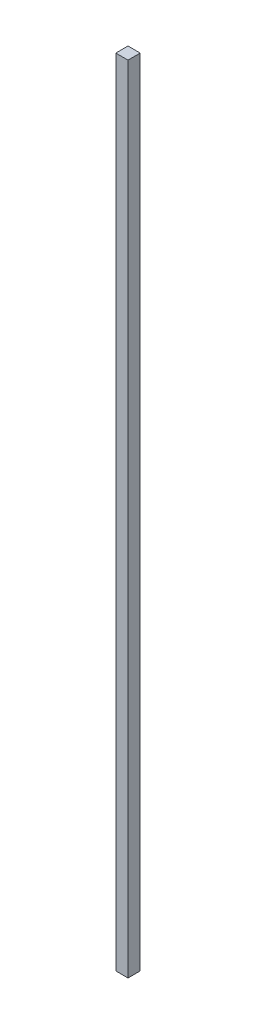
ISO-10303-21;
HEADER;
FILE_DESCRIPTION(('STEP AP214'),'2;1');
FILE_NAME('part.step','',(''),(''),'','','');
FILE_SCHEMA(('AUTOMOTIVE_DESIGN { 1 0 10303 214 1 1 1 1 }'));
ENDSEC;
DATA;
#1=APPLICATION_CONTEXT('core data for automotive mechanical design processes');
#2=APPLICATION_PROTOCOL_DEFINITION('international standard','automotive_design',2000,#1);
#3=PRODUCT_CONTEXT('',#1,'mechanical');
#4=PRODUCT('Part','Part','',(#3));
#5=PRODUCT_RELATED_PRODUCT_CATEGORY('part','',(#4));
#6=PRODUCT_DEFINITION_FORMATION('','',#4);
#7=PRODUCT_DEFINITION_CONTEXT('part definition',#1,'design');
#8=PRODUCT_DEFINITION('design','',#6,#7);
#9=PRODUCT_DEFINITION_SHAPE('','',#8);
#10=(LENGTH_UNIT() NAMED_UNIT(*) SI_UNIT(.MILLI.,.METRE.));
#11=(NAMED_UNIT(*) PLANE_ANGLE_UNIT() SI_UNIT($,.RADIAN.));
#12=(NAMED_UNIT(*) SI_UNIT($,.STERADIAN.) SOLID_ANGLE_UNIT());
#13=UNCERTAINTY_MEASURE_WITH_UNIT(LENGTH_MEASURE(1.E-05),#10,'distance_accuracy_value','');
#14=(GEOMETRIC_REPRESENTATION_CONTEXT(3) GLOBAL_UNCERTAINTY_ASSIGNED_CONTEXT((#13)) GLOBAL_UNIT_ASSIGNED_CONTEXT((#10,
#11,#12)) REPRESENTATION_CONTEXT('',''));
#15=CARTESIAN_POINT('',(0.,0.,0.));
#16=DIRECTION('',(0.,0.,1.));
#17=DIRECTION('',(1.,0.,0.));
#18=AXIS2_PLACEMENT_3D('',#15,#16,#17);
#19=CARTESIAN_POINT('',(10.,1300.,10.));
#20=DIRECTION('',(-1.,0.,0.));
#21=DIRECTION('',(0.,0.,1.));
#22=AXIS2_PLACEMENT_3D('',#19,#20,#21);
#23=PLANE('',#22);
#24=DIRECTION('',(0.,-1.,0.));
#25=VECTOR('',#24,1.);
#26=CARTESIAN_POINT('',(10.,1300.,10.));
#27=LINE('',#26,#25);
#28=CARTESIAN_POINT('',(10.,1301.,10.));
#29=VERTEX_POINT('',#28);
#30=CARTESIAN_POINT('',(10.,-1.,10.));
#31=VERTEX_POINT('',#30);
#32=EDGE_CURVE('E194',#29,#31,#27,.T.);
#33=ORIENTED_EDGE('',*,*,#32,.T.);
#34=DIRECTION('',(0.,0.,1.));
#35=VECTOR('',#34,1.);
#36=CARTESIAN_POINT('',(10.,-1.,10.));
#37=LINE('',#36,#35);
#38=CARTESIAN_POINT('',(10.,-1.,-10.));
#39=VERTEX_POINT('',#38);
#40=EDGE_CURVE('E134',#39,#31,#37,.T.);
#41=ORIENTED_EDGE('',*,*,#40,.F.);
#42=DIRECTION('',(0.,-1.,0.));
#43=VECTOR('',#42,1.);
#44=CARTESIAN_POINT('',(10.,1300.,-10.));
#45=LINE('',#44,#43);
#46=CARTESIAN_POINT('',(10.,1301.,-10.));
#47=VERTEX_POINT('',#46);
#48=EDGE_CURVE('E11',#47,#39,#45,.T.);
#49=ORIENTED_EDGE('',*,*,#48,.F.);
#50=DIRECTION('',(0.,0.,-1.));
#51=VECTOR('',#50,1.);
#52=CARTESIAN_POINT('',(10.,1301.,-10.));
#53=LINE('',#52,#51);
#54=EDGE_CURVE('E153',#29,#47,#53,.T.);
#55=ORIENTED_EDGE('',*,*,#54,.F.);
#56=EDGE_LOOP('',(#33,#41,#49,#55));
#57=FACE_BOUND('',#56,.T.);
#58=ADVANCED_FACE('F40',(#57),#23,.F.);
#59=CARTESIAN_POINT('',(-10.,1300.,-10.));
#60=DIRECTION('',(0.,0.,1.));
#61=DIRECTION('',(1.,0.,0.));
#62=AXIS2_PLACEMENT_3D('',#59,#60,#61);
#63=PLANE('',#62);
#64=ORIENTED_EDGE('',*,*,#48,.T.);
#65=DIRECTION('',(1.,0.,0.));
#66=VECTOR('',#65,1.);
#67=CARTESIAN_POINT('',(-10.,-1.,-10.));
#68=LINE('',#67,#66);
#69=CARTESIAN_POINT('',(-10.,-1.,-10.));
#70=VERTEX_POINT('',#69);
#71=EDGE_CURVE('E128',#70,#39,#68,.T.);
#72=ORIENTED_EDGE('',*,*,#71,.F.);
#73=DIRECTION('',(0.,-1.,0.));
#74=VECTOR('',#73,1.);
#75=CARTESIAN_POINT('',(-10.,1300.,-10.));
#76=LINE('',#75,#74);
#77=CARTESIAN_POINT('',(-10.,1301.,-10.));
#78=VERTEX_POINT('',#77);
#79=EDGE_CURVE('E49',#78,#70,#76,.T.);
#80=ORIENTED_EDGE('',*,*,#79,.F.);
#81=DIRECTION('',(-1.,0.,0.));
#82=VECTOR('',#81,1.);
#83=CARTESIAN_POINT('',(-10.,1301.,-10.));
#84=LINE('',#83,#82);
#85=EDGE_CURVE('E157',#47,#78,#84,.T.);
#86=ORIENTED_EDGE('',*,*,#85,.F.);
#87=EDGE_LOOP('',(#64,#72,#80,#86));
#88=FACE_BOUND('',#87,.T.);
#89=ADVANCED_FACE('F129',(#88),#63,.F.);
#90=CARTESIAN_POINT('',(-10.,1300.,10.));
#91=DIRECTION('',(1.,0.,0.));
#92=DIRECTION('',(0.,0.,-1.));
#93=AXIS2_PLACEMENT_3D('',#90,#91,#92);
#94=PLANE('',#93);
#95=ORIENTED_EDGE('',*,*,#79,.T.);
#96=DIRECTION('',(0.,0.,-1.));
#97=VECTOR('',#96,1.);
#98=CARTESIAN_POINT('',(-10.,-1.,10.));
#99=LINE('',#98,#97);
#100=CARTESIAN_POINT('',(-10.,-1.,10.));
#101=VERTEX_POINT('',#100);
#102=EDGE_CURVE('E119',#101,#70,#99,.T.);
#103=ORIENTED_EDGE('',*,*,#102,.F.);
#104=DIRECTION('',(0.,-1.,0.));
#105=VECTOR('',#104,1.);
#106=CARTESIAN_POINT('',(-10.,1300.,10.));
#107=LINE('',#106,#105);
#108=CARTESIAN_POINT('',(-10.,1301.,10.));
#109=VERTEX_POINT('',#108);
#110=EDGE_CURVE('E126',#109,#101,#107,.T.);
#111=ORIENTED_EDGE('',*,*,#110,.F.);
#112=DIRECTION('',(0.,0.,1.));
#113=VECTOR('',#112,1.);
#114=CARTESIAN_POINT('',(-10.,1301.,-10.));
#115=LINE('',#114,#113);
#116=EDGE_CURVE('E121',#78,#109,#115,.T.);
#117=ORIENTED_EDGE('',*,*,#116,.F.);
#118=EDGE_LOOP('',(#95,#103,#111,#117));
#119=FACE_BOUND('',#118,.T.);
#120=ADVANCED_FACE('F117',(#119),#94,.F.);
#121=CARTESIAN_POINT('',(-10.,1300.,10.));
#122=DIRECTION('',(0.,0.,-1.));
#123=DIRECTION('',(-1.,0.,0.));
#124=AXIS2_PLACEMENT_3D('',#121,#122,#123);
#125=PLANE('',#124);
#126=ORIENTED_EDGE('',*,*,#110,.T.);
#127=DIRECTION('',(-1.,0.,0.));
#128=VECTOR('',#127,1.);
#129=CARTESIAN_POINT('',(-10.,-1.,10.));
#130=LINE('',#129,#128);
#131=EDGE_CURVE('E139',#31,#101,#130,.T.);
#132=ORIENTED_EDGE('',*,*,#131,.F.);
#133=ORIENTED_EDGE('',*,*,#32,.F.);
#134=DIRECTION('',(1.,0.,0.));
#135=VECTOR('',#134,1.);
#136=CARTESIAN_POINT('',(-10.,1301.,10.));
#137=LINE('',#136,#135);
#138=EDGE_CURVE('E149',#109,#29,#137,.T.);
#139=ORIENTED_EDGE('',*,*,#138,.F.);
#140=EDGE_LOOP('',(#126,#132,#133,#139));
#141=FACE_BOUND('',#140,.T.);
#142=ADVANCED_FACE('F200',(#141),#125,.F.);
#143=CARTESIAN_POINT('',(0.,1301.,0.));
#144=DIRECTION('',(0.,1.,0.));
#145=DIRECTION('',(0.,0.,1.));
#146=AXIS2_PLACEMENT_3D('',#143,#144,#145);
#147=PLANE('',#146);
#148=ORIENTED_EDGE('',*,*,#116,.T.);
#149=ORIENTED_EDGE('',*,*,#138,.T.);
#150=ORIENTED_EDGE('',*,*,#54,.T.);
#151=ORIENTED_EDGE('',*,*,#85,.T.);
#152=EDGE_LOOP('',(#148,#149,#150,#151));
#153=FACE_BOUND('',#152,.T.);
#154=ADVANCED_FACE('F203',(#153),#147,.T.);
#155=CARTESIAN_POINT('',(0.,-1.,0.));
#156=DIRECTION('',(0.,-1.,0.));
#157=DIRECTION('',(0.,0.,-1.));
#158=AXIS2_PLACEMENT_3D('',#155,#156,#157);
#159=PLANE('',#158);
#160=ORIENTED_EDGE('',*,*,#102,.T.);
#161=ORIENTED_EDGE('',*,*,#71,.T.);
#162=ORIENTED_EDGE('',*,*,#40,.T.);
#163=ORIENTED_EDGE('',*,*,#131,.T.);
#164=EDGE_LOOP('',(#160,#161,#162,#163));
#165=FACE_BOUND('',#164,.T.);
#166=ADVANCED_FACE('F137',(#165),#159,.T.);
#167=CLOSED_SHELL('',(#58,#89,#120,#142,#154,#166));
#168=CARTESIAN_POINT('',(0.,0.,0.));
#169=DIRECTION('',(0.,-1.,0.));
#170=DIRECTION('',(0.,0.,-1.));
#171=AXIS2_PLACEMENT_3D('',#168,#169,#170);
#172=PLANE('',#171);
#173=DIRECTION('',(0.,0.,-1.));
#174=VECTOR('',#173,1.);
#175=CARTESIAN_POINT('',(8.,0.,8.));
#176=LINE('',#175,#174);
#177=CARTESIAN_POINT('',(8.,0.,8.));
#178=VERTEX_POINT('',#177);
#179=CARTESIAN_POINT('',(8.,0.,-8.));
#180=VERTEX_POINT('',#179);
#181=EDGE_CURVE('E175',#178,#180,#176,.T.);
#182=ORIENTED_EDGE('',*,*,#181,.T.);
#183=DIRECTION('',(-1.,0.,0.));
#184=VECTOR('',#183,1.);
#185=CARTESIAN_POINT('',(-8.,0.,-8.));
#186=LINE('',#185,#184);
#187=CARTESIAN_POINT('',(-8.,0.,-8.));
#188=VERTEX_POINT('',#187);
#189=EDGE_CURVE('E163',#180,#188,#186,.T.);
#190=ORIENTED_EDGE('',*,*,#189,.T.);
#191=DIRECTION('',(0.,0.,1.));
#192=VECTOR('',#191,1.);
#193=CARTESIAN_POINT('',(-8.,0.,8.));
#194=LINE('',#193,#192);
#195=CARTESIAN_POINT('',(-8.,0.,8.));
#196=VERTEX_POINT('',#195);
#197=EDGE_CURVE('E56',#188,#196,#194,.T.);
#198=ORIENTED_EDGE('',*,*,#197,.T.);
#199=DIRECTION('',(1.,0.,0.));
#200=VECTOR('',#199,1.);
#201=CARTESIAN_POINT('',(-8.,0.,8.));
#202=LINE('',#201,#200);
#203=EDGE_CURVE('E77',#196,#178,#202,.T.);
#204=ORIENTED_EDGE('',*,*,#203,.T.);
#205=EDGE_LOOP('',(#182,#190,#198,#204));
#206=FACE_BOUND('',#205,.T.);
#207=ADVANCED_FACE('F235',(#206),#172,.F.);
#208=CARTESIAN_POINT('',(0.,1300.,0.));
#209=DIRECTION('',(0.,1.,0.));
#210=DIRECTION('',(0.,0.,1.));
#211=AXIS2_PLACEMENT_3D('',#208,#209,#210);
#212=PLANE('',#211);
#213=DIRECTION('',(0.,0.,1.));
#214=VECTOR('',#213,1.);
#215=CARTESIAN_POINT('',(-8.,1300.,8.));
#216=LINE('',#215,#214);
#217=CARTESIAN_POINT('',(-8.,1300.,-8.));
#218=VERTEX_POINT('',#217);
#219=CARTESIAN_POINT('',(-8.,1300.,8.));
#220=VERTEX_POINT('',#219);
#221=EDGE_CURVE('E81',#218,#220,#216,.T.);
#222=ORIENTED_EDGE('',*,*,#221,.F.);
#223=DIRECTION('',(-1.,0.,0.));
#224=VECTOR('',#223,1.);
#225=CARTESIAN_POINT('',(-8.,1300.,-8.));
#226=LINE('',#225,#224);
#227=CARTESIAN_POINT('',(8.,1300.,-8.));
#228=VERTEX_POINT('',#227);
#229=EDGE_CURVE('E84',#228,#218,#226,.T.);
#230=ORIENTED_EDGE('',*,*,#229,.F.);
#231=DIRECTION('',(0.,0.,-1.));
#232=VECTOR('',#231,1.);
#233=CARTESIAN_POINT('',(8.,1300.,8.));
#234=LINE('',#233,#232);
#235=CARTESIAN_POINT('',(8.,1300.,8.));
#236=VERTEX_POINT('',#235);
#237=EDGE_CURVE('E65',#236,#228,#234,.T.);
#238=ORIENTED_EDGE('',*,*,#237,.F.);
#239=DIRECTION('',(1.,0.,0.));
#240=VECTOR('',#239,1.);
#241=CARTESIAN_POINT('',(-8.,1300.,8.));
#242=LINE('',#241,#240);
#243=EDGE_CURVE('E162',#220,#236,#242,.T.);
#244=ORIENTED_EDGE('',*,*,#243,.F.);
#245=EDGE_LOOP('',(#222,#230,#238,#244));
#246=FACE_BOUND('',#245,.T.);
#247=ADVANCED_FACE('F228',(#246),#212,.F.);
#248=CARTESIAN_POINT('',(8.,1300.,8.));
#249=DIRECTION('',(-1.,0.,0.));
#250=DIRECTION('',(0.,0.,1.));
#251=AXIS2_PLACEMENT_3D('',#248,#249,#250);
#252=PLANE('',#251);
#253=ORIENTED_EDGE('',*,*,#181,.F.);
#254=DIRECTION('',(0.,-1.,0.));
#255=VECTOR('',#254,1.);
#256=CARTESIAN_POINT('',(8.,1300.,8.));
#257=LINE('',#256,#255);
#258=EDGE_CURVE('E188',#236,#178,#257,.T.);
#259=ORIENTED_EDGE('',*,*,#258,.F.);
#260=ORIENTED_EDGE('',*,*,#237,.T.);
#261=DIRECTION('',(0.,-1.,0.));
#262=VECTOR('',#261,1.);
#263=CARTESIAN_POINT('',(8.,1300.,-8.));
#264=LINE('',#263,#262);
#265=EDGE_CURVE('E184',#228,#180,#264,.T.);
#266=ORIENTED_EDGE('',*,*,#265,.T.);
#267=EDGE_LOOP('',(#253,#259,#260,#266));
#268=FACE_BOUND('',#267,.T.);
#269=ADVANCED_FACE('F225',(#268),#252,.T.);
#270=CARTESIAN_POINT('',(-8.,1300.,8.));
#271=DIRECTION('',(0.,0.,-1.));
#272=DIRECTION('',(-1.,0.,0.));
#273=AXIS2_PLACEMENT_3D('',#270,#271,#272);
#274=PLANE('',#273);
#275=ORIENTED_EDGE('',*,*,#203,.F.);
#276=DIRECTION('',(0.,-1.,0.));
#277=VECTOR('',#276,1.);
#278=CARTESIAN_POINT('',(-8.,1300.,8.));
#279=LINE('',#278,#277);
#280=EDGE_CURVE('E191',#220,#196,#279,.T.);
#281=ORIENTED_EDGE('',*,*,#280,.F.);
#282=ORIENTED_EDGE('',*,*,#243,.T.);
#283=ORIENTED_EDGE('',*,*,#258,.T.);
#284=EDGE_LOOP('',(#275,#281,#282,#283));
#285=FACE_BOUND('',#284,.T.);
#286=ADVANCED_FACE('F221',(#285),#274,.T.);
#287=CARTESIAN_POINT('',(-8.,1300.,8.));
#288=DIRECTION('',(1.,0.,0.));
#289=DIRECTION('',(0.,0.,-1.));
#290=AXIS2_PLACEMENT_3D('',#287,#288,#289);
#291=PLANE('',#290);
#292=ORIENTED_EDGE('',*,*,#197,.F.);
#293=DIRECTION('',(0.,-1.,0.));
#294=VECTOR('',#293,1.);
#295=CARTESIAN_POINT('',(-8.,1300.,-8.));
#296=LINE('',#295,#294);
#297=EDGE_CURVE('E170',#218,#188,#296,.T.);
#298=ORIENTED_EDGE('',*,*,#297,.F.);
#299=ORIENTED_EDGE('',*,*,#221,.T.);
#300=ORIENTED_EDGE('',*,*,#280,.T.);
#301=EDGE_LOOP('',(#292,#298,#299,#300));
#302=FACE_BOUND('',#301,.T.);
#303=ADVANCED_FACE('F217',(#302),#291,.T.);
#304=CARTESIAN_POINT('',(-8.,1300.,-8.));
#305=DIRECTION('',(0.,0.,1.));
#306=DIRECTION('',(1.,0.,0.));
#307=AXIS2_PLACEMENT_3D('',#304,#305,#306);
#308=PLANE('',#307);
#309=ORIENTED_EDGE('',*,*,#189,.F.);
#310=ORIENTED_EDGE('',*,*,#265,.F.);
#311=ORIENTED_EDGE('',*,*,#229,.T.);
#312=ORIENTED_EDGE('',*,*,#297,.T.);
#313=EDGE_LOOP('',(#309,#310,#311,#312));
#314=FACE_BOUND('',#313,.T.);
#315=ADVANCED_FACE('F220',(#314),#308,.T.);
#316=CLOSED_SHELL('',(#207,#247,#269,#286,#303,#315));
#317=ORIENTED_CLOSED_SHELL('',*,#316,.T.);
#318=BREP_WITH_VOIDS('B2',#167,(#317));
#319=ADVANCED_BREP_SHAPE_REPRESENTATION('',(#18,#318),#14);
#320=SHAPE_DEFINITION_REPRESENTATION(#9,#319);
ENDSEC;
END-ISO-10303-21;
